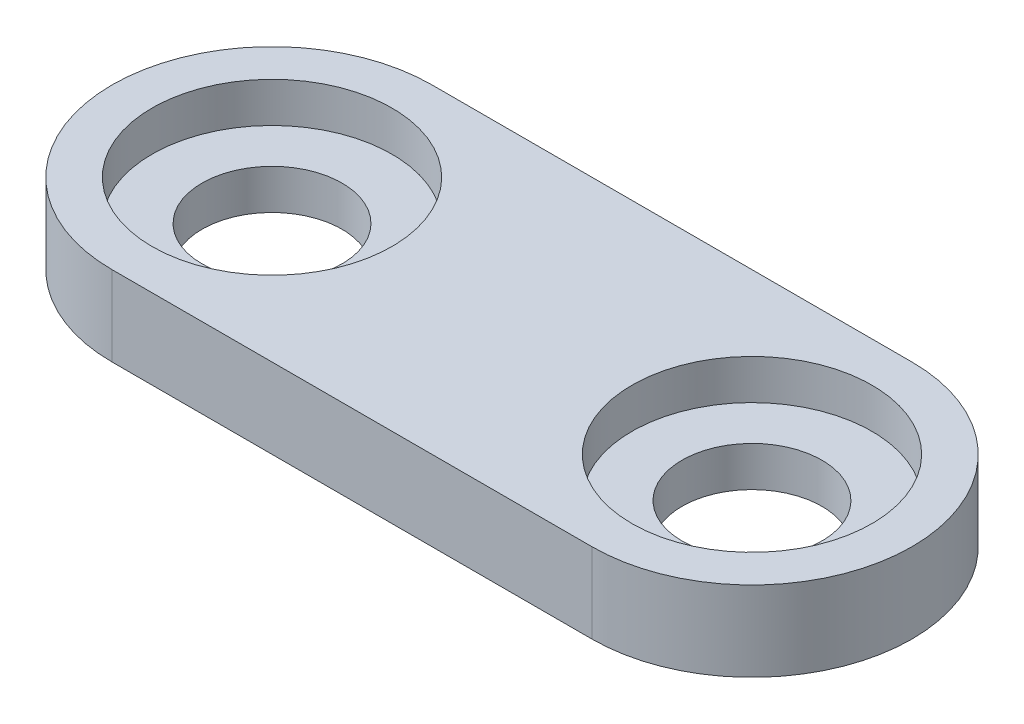
ISO-10303-21;
HEADER;
FILE_DESCRIPTION(('STEP AP214'),'2;1');
FILE_NAME('part.step','',(''),(''),'','','');
FILE_SCHEMA(('AUTOMOTIVE_DESIGN { 1 0 10303 214 1 1 1 1 }'));
ENDSEC;
DATA;
#1=APPLICATION_CONTEXT('core data for automotive mechanical design processes');
#2=APPLICATION_PROTOCOL_DEFINITION('international standard','automotive_design',2000,#1);
#3=PRODUCT_CONTEXT('',#1,'mechanical');
#4=PRODUCT('Part','Part','',(#3));
#5=PRODUCT_RELATED_PRODUCT_CATEGORY('part','',(#4));
#6=PRODUCT_DEFINITION_FORMATION('','',#4);
#7=PRODUCT_DEFINITION_CONTEXT('part definition',#1,'design');
#8=PRODUCT_DEFINITION('design','',#6,#7);
#9=PRODUCT_DEFINITION_SHAPE('','',#8);
#10=(LENGTH_UNIT() NAMED_UNIT(*) SI_UNIT(.MILLI.,.METRE.));
#11=(NAMED_UNIT(*) PLANE_ANGLE_UNIT() SI_UNIT($,.RADIAN.));
#12=(NAMED_UNIT(*) SI_UNIT($,.STERADIAN.) SOLID_ANGLE_UNIT());
#13=UNCERTAINTY_MEASURE_WITH_UNIT(LENGTH_MEASURE(1.E-05),#10,'distance_accuracy_value','');
#14=(GEOMETRIC_REPRESENTATION_CONTEXT(3) GLOBAL_UNCERTAINTY_ASSIGNED_CONTEXT((#13)) GLOBAL_UNIT_ASSIGNED_CONTEXT((#10,
#11,#12)) REPRESENTATION_CONTEXT('',''));
#15=CARTESIAN_POINT('',(0.,0.,0.));
#16=DIRECTION('',(0.,0.,1.));
#17=DIRECTION('',(1.,0.,0.));
#18=AXIS2_PLACEMENT_3D('',#15,#16,#17);
#19=CARTESIAN_POINT('',(-6.,2.,0.));
#20=DIRECTION('',(0.,-1.,0.));
#21=DIRECTION('',(0.,0.,-1.));
#22=AXIS2_PLACEMENT_3D('',#19,#20,#21);
#23=CYLINDRICAL_SURFACE('',#22,1.75);
#24=CARTESIAN_POINT('',(-6.,0.,0.));
#25=DIRECTION('',(0.,1.,0.));
#26=DIRECTION('',(0.,0.,1.));
#27=AXIS2_PLACEMENT_3D('',#24,#25,#26);
#28=CIRCLE('',#27,1.75);
#29=CARTESIAN_POINT('',(-6.,0.,1.75));
#30=VERTEX_POINT('',#29);
#31=EDGE_CURVE('E108',#30,#30,#28,.T.);
#32=ORIENTED_EDGE('',*,*,#31,.F.);
#33=EDGE_LOOP('',(#32));
#34=FACE_BOUND('',#33,.T.);
#35=CARTESIAN_POINT('',(-6.,1.,0.));
#36=DIRECTION('',(0.,1.,0.));
#37=DIRECTION('',(0.,0.,1.));
#38=AXIS2_PLACEMENT_3D('',#35,#36,#37);
#39=CIRCLE('',#38,1.75);
#40=CARTESIAN_POINT('',(-6.,1.,1.75));
#41=VERTEX_POINT('',#40);
#42=EDGE_CURVE('E43',#41,#41,#39,.T.);
#43=ORIENTED_EDGE('',*,*,#42,.T.);
#44=EDGE_LOOP('',(#43));
#45=FACE_BOUND('',#44,.T.);
#46=ADVANCED_FACE('F39',(#34,#45),#23,.F.);
#47=CARTESIAN_POINT('',(6.,2.,0.));
#48=DIRECTION('',(0.,-1.,0.));
#49=DIRECTION('',(0.,0.,-1.));
#50=AXIS2_PLACEMENT_3D('',#47,#48,#49);
#51=CYLINDRICAL_SURFACE('',#50,1.75);
#52=CARTESIAN_POINT('',(6.,0.,0.));
#53=DIRECTION('',(0.,1.,0.));
#54=DIRECTION('',(0.,0.,1.));
#55=AXIS2_PLACEMENT_3D('',#52,#53,#54);
#56=CIRCLE('',#55,1.75);
#57=CARTESIAN_POINT('',(6.,0.,1.75));
#58=VERTEX_POINT('',#57);
#59=EDGE_CURVE('E116',#58,#58,#56,.T.);
#60=ORIENTED_EDGE('',*,*,#59,.F.);
#61=EDGE_LOOP('',(#60));
#62=FACE_BOUND('',#61,.T.);
#63=CARTESIAN_POINT('',(6.,1.,0.));
#64=DIRECTION('',(0.,1.,0.));
#65=DIRECTION('',(0.,0.,1.));
#66=AXIS2_PLACEMENT_3D('',#63,#64,#65);
#67=CIRCLE('',#66,1.75);
#68=CARTESIAN_POINT('',(6.,1.,1.75));
#69=VERTEX_POINT('',#68);
#70=EDGE_CURVE('E111',#69,#69,#67,.T.);
#71=ORIENTED_EDGE('',*,*,#70,.T.);
#72=EDGE_LOOP('',(#71));
#73=FACE_BOUND('',#72,.T.);
#74=ADVANCED_FACE('F144',(#62,#73),#51,.F.);
#75=CARTESIAN_POINT('',(-6.,2.,0.));
#76=DIRECTION('',(0.,-1.,0.));
#77=DIRECTION('',(0.,0.,-1.));
#78=AXIS2_PLACEMENT_3D('',#75,#76,#77);
#79=PLANE('',#78);
#80=CARTESIAN_POINT('',(-6.,2.,0.));
#81=DIRECTION('',(0.,1.,0.));
#82=DIRECTION('',(0.,0.,1.));
#83=AXIS2_PLACEMENT_3D('',#80,#81,#82);
#84=CIRCLE('',#83,3.);
#85=CARTESIAN_POINT('',(-6.,2.,3.));
#86=VERTEX_POINT('',#85);
#87=EDGE_CURVE('E125',#86,#86,#84,.T.);
#88=ORIENTED_EDGE('',*,*,#87,.F.);
#89=EDGE_LOOP('',(#88));
#90=FACE_BOUND('',#89,.T.);
#91=CARTESIAN_POINT('',(6.,2.,0.));
#92=DIRECTION('',(0.,1.,0.));
#93=DIRECTION('',(0.,0.,1.));
#94=AXIS2_PLACEMENT_3D('',#91,#92,#93);
#95=CIRCLE('',#94,3.);
#96=CARTESIAN_POINT('',(6.,2.,3.));
#97=VERTEX_POINT('',#96);
#98=EDGE_CURVE('E130',#97,#97,#95,.T.);
#99=ORIENTED_EDGE('',*,*,#98,.F.);
#100=EDGE_LOOP('',(#99));
#101=FACE_BOUND('',#100,.T.);
#102=CARTESIAN_POINT('',(-6.,2.,0.));
#103=DIRECTION('',(0.,1.,0.));
#104=DIRECTION('',(0.,0.,-1.));
#105=AXIS2_PLACEMENT_3D('',#102,#103,#104);
#106=CIRCLE('',#105,4.);
#107=CARTESIAN_POINT('',(-6.,2.,-4.));
#108=VERTEX_POINT('',#107);
#109=CARTESIAN_POINT('',(-6.,2.,4.));
#110=VERTEX_POINT('',#109);
#111=EDGE_CURVE('E91',#108,#110,#106,.T.);
#112=ORIENTED_EDGE('',*,*,#111,.T.);
#113=DIRECTION('',(1.,0.,0.));
#114=VECTOR('',#113,1.);
#115=CARTESIAN_POINT('',(6.,2.,4.));
#116=LINE('',#115,#114);
#117=CARTESIAN_POINT('',(6.,2.,4.));
#118=VERTEX_POINT('',#117);
#119=EDGE_CURVE('E86',#110,#118,#116,.T.);
#120=ORIENTED_EDGE('',*,*,#119,.T.);
#121=CARTESIAN_POINT('',(6.,2.,0.));
#122=DIRECTION('',(0.,1.,0.));
#123=DIRECTION('',(0.,0.,1.));
#124=AXIS2_PLACEMENT_3D('',#121,#122,#123);
#125=CIRCLE('',#124,4.);
#126=CARTESIAN_POINT('',(6.,2.,-4.));
#127=VERTEX_POINT('',#126);
#128=EDGE_CURVE('E93',#118,#127,#125,.T.);
#129=ORIENTED_EDGE('',*,*,#128,.T.);
#130=DIRECTION('',(-1.,0.,0.));
#131=VECTOR('',#130,1.);
#132=CARTESIAN_POINT('',(-6.,2.,-4.));
#133=LINE('',#132,#131);
#134=EDGE_CURVE('E59',#127,#108,#133,.T.);
#135=ORIENTED_EDGE('',*,*,#134,.T.);
#136=EDGE_LOOP('',(#112,#120,#129,#135));
#137=FACE_BOUND('',#136,.T.);
#138=ADVANCED_FACE('F90',(#90,#101,#137),#79,.F.);
#139=CARTESIAN_POINT('',(-6.,0.,0.));
#140=DIRECTION('',(0.,-1.,0.));
#141=DIRECTION('',(0.,0.,-1.));
#142=AXIS2_PLACEMENT_3D('',#139,#140,#141);
#143=PLANE('',#142);
#144=ORIENTED_EDGE('',*,*,#31,.T.);
#145=EDGE_LOOP('',(#144));
#146=FACE_BOUND('',#145,.T.);
#147=CARTESIAN_POINT('',(-6.,0.,0.));
#148=DIRECTION('',(0.,1.,0.));
#149=DIRECTION('',(0.,0.,-1.));
#150=AXIS2_PLACEMENT_3D('',#147,#148,#149);
#151=CIRCLE('',#150,4.);
#152=CARTESIAN_POINT('',(-6.,0.,-4.));
#153=VERTEX_POINT('',#152);
#154=CARTESIAN_POINT('',(-6.,0.,4.));
#155=VERTEX_POINT('',#154);
#156=EDGE_CURVE('E106',#153,#155,#151,.T.);
#157=ORIENTED_EDGE('',*,*,#156,.F.);
#158=DIRECTION('',(-1.,0.,0.));
#159=VECTOR('',#158,1.);
#160=CARTESIAN_POINT('',(-6.,0.,-4.));
#161=LINE('',#160,#159);
#162=CARTESIAN_POINT('',(6.,0.,-4.));
#163=VERTEX_POINT('',#162);
#164=EDGE_CURVE('E81',#163,#153,#161,.T.);
#165=ORIENTED_EDGE('',*,*,#164,.F.);
#166=CARTESIAN_POINT('',(6.,0.,0.));
#167=DIRECTION('',(0.,1.,0.));
#168=DIRECTION('',(0.,0.,1.));
#169=AXIS2_PLACEMENT_3D('',#166,#167,#168);
#170=CIRCLE('',#169,4.);
#171=CARTESIAN_POINT('',(6.,0.,4.));
#172=VERTEX_POINT('',#171);
#173=EDGE_CURVE('E73',#172,#163,#170,.T.);
#174=ORIENTED_EDGE('',*,*,#173,.F.);
#175=DIRECTION('',(1.,0.,0.));
#176=VECTOR('',#175,1.);
#177=CARTESIAN_POINT('',(6.,0.,4.));
#178=LINE('',#177,#176);
#179=EDGE_CURVE('E100',#155,#172,#178,.T.);
#180=ORIENTED_EDGE('',*,*,#179,.F.);
#181=EDGE_LOOP('',(#157,#165,#174,#180));
#182=FACE_BOUND('',#181,.T.);
#183=ORIENTED_EDGE('',*,*,#59,.T.);
#184=EDGE_LOOP('',(#183));
#185=FACE_BOUND('',#184,.T.);
#186=ADVANCED_FACE('F139',(#146,#182,#185),#143,.T.);
#187=CARTESIAN_POINT('',(-6.,2.,0.));
#188=DIRECTION('',(0.,-1.,0.));
#189=DIRECTION('',(0.,0.,-1.));
#190=AXIS2_PLACEMENT_3D('',#187,#188,#189);
#191=CYLINDRICAL_SURFACE('',#190,4.);
#192=ORIENTED_EDGE('',*,*,#156,.T.);
#193=DIRECTION('',(0.,-1.,0.));
#194=VECTOR('',#193,1.);
#195=CARTESIAN_POINT('',(-6.,2.,4.));
#196=LINE('',#195,#194);
#197=EDGE_CURVE('E11',#110,#155,#196,.T.);
#198=ORIENTED_EDGE('',*,*,#197,.F.);
#199=ORIENTED_EDGE('',*,*,#111,.F.);
#200=DIRECTION('',(0.,-1.,0.));
#201=VECTOR('',#200,1.);
#202=CARTESIAN_POINT('',(-6.,2.,-4.));
#203=LINE('',#202,#201);
#204=EDGE_CURVE('E105',#108,#153,#203,.T.);
#205=ORIENTED_EDGE('',*,*,#204,.T.);
#206=EDGE_LOOP('',(#192,#198,#199,#205));
#207=FACE_BOUND('',#206,.T.);
#208=ADVANCED_FACE('F41',(#207),#191,.T.);
#209=CARTESIAN_POINT('',(6.,2.,4.));
#210=DIRECTION('',(0.,0.,-1.));
#211=DIRECTION('',(-1.,0.,0.));
#212=AXIS2_PLACEMENT_3D('',#209,#210,#211);
#213=PLANE('',#212);
#214=ORIENTED_EDGE('',*,*,#179,.T.);
#215=DIRECTION('',(0.,-1.,0.));
#216=VECTOR('',#215,1.);
#217=CARTESIAN_POINT('',(6.,2.,4.));
#218=LINE('',#217,#216);
#219=EDGE_CURVE('E47',#118,#172,#218,.T.);
#220=ORIENTED_EDGE('',*,*,#219,.F.);
#221=ORIENTED_EDGE('',*,*,#119,.F.);
#222=ORIENTED_EDGE('',*,*,#197,.T.);
#223=EDGE_LOOP('',(#214,#220,#221,#222));
#224=FACE_BOUND('',#223,.T.);
#225=ADVANCED_FACE('F96',(#224),#213,.F.);
#226=CARTESIAN_POINT('',(6.,2.,0.));
#227=DIRECTION('',(0.,-1.,0.));
#228=DIRECTION('',(0.,0.,-1.));
#229=AXIS2_PLACEMENT_3D('',#226,#227,#228);
#230=CYLINDRICAL_SURFACE('',#229,4.);
#231=ORIENTED_EDGE('',*,*,#173,.T.);
#232=DIRECTION('',(0.,-1.,0.));
#233=VECTOR('',#232,1.);
#234=CARTESIAN_POINT('',(6.,2.,-4.));
#235=LINE('',#234,#233);
#236=EDGE_CURVE('E98',#127,#163,#235,.T.);
#237=ORIENTED_EDGE('',*,*,#236,.F.);
#238=ORIENTED_EDGE('',*,*,#128,.F.);
#239=ORIENTED_EDGE('',*,*,#219,.T.);
#240=EDGE_LOOP('',(#231,#237,#238,#239));
#241=FACE_BOUND('',#240,.T.);
#242=ADVANCED_FACE('F99',(#241),#230,.T.);
#243=CARTESIAN_POINT('',(-6.,2.,-4.));
#244=DIRECTION('',(0.,0.,1.));
#245=DIRECTION('',(1.,0.,0.));
#246=AXIS2_PLACEMENT_3D('',#243,#244,#245);
#247=PLANE('',#246);
#248=ORIENTED_EDGE('',*,*,#164,.T.);
#249=ORIENTED_EDGE('',*,*,#204,.F.);
#250=ORIENTED_EDGE('',*,*,#134,.F.);
#251=ORIENTED_EDGE('',*,*,#236,.T.);
#252=EDGE_LOOP('',(#248,#249,#250,#251));
#253=FACE_BOUND('',#252,.T.);
#254=ADVANCED_FACE('F162',(#253),#247,.F.);
#255=CARTESIAN_POINT('',(6.,1.,0.));
#256=DIRECTION('',(0.,1.,0.));
#257=DIRECTION('',(0.,0.,1.));
#258=AXIS2_PLACEMENT_3D('',#255,#256,#257);
#259=CYLINDRICAL_SURFACE('',#258,3.);
#260=CARTESIAN_POINT('',(6.,1.,0.));
#261=DIRECTION('',(0.,1.,0.));
#262=DIRECTION('',(0.,0.,1.));
#263=AXIS2_PLACEMENT_3D('',#260,#261,#262);
#264=CIRCLE('',#263,3.);
#265=CARTESIAN_POINT('',(6.,1.,3.));
#266=VERTEX_POINT('',#265);
#267=EDGE_CURVE('E134',#266,#266,#264,.T.);
#268=ORIENTED_EDGE('',*,*,#267,.F.);
#269=EDGE_LOOP('',(#268));
#270=FACE_BOUND('',#269,.T.);
#271=ORIENTED_EDGE('',*,*,#98,.T.);
#272=EDGE_LOOP('',(#271));
#273=FACE_BOUND('',#272,.T.);
#274=ADVANCED_FACE('F159',(#270,#273),#259,.F.);
#275=CARTESIAN_POINT('',(6.,1.,0.));
#276=DIRECTION('',(0.,1.,0.));
#277=DIRECTION('',(0.,0.,1.));
#278=AXIS2_PLACEMENT_3D('',#275,#276,#277);
#279=PLANE('',#278);
#280=ORIENTED_EDGE('',*,*,#70,.F.);
#281=EDGE_LOOP('',(#280));
#282=FACE_BOUND('',#281,.T.);
#283=ORIENTED_EDGE('',*,*,#267,.T.);
#284=EDGE_LOOP('',(#283));
#285=FACE_BOUND('',#284,.T.);
#286=ADVANCED_FACE('F156',(#282,#285),#279,.T.);
#287=CARTESIAN_POINT('',(-6.,1.,0.));
#288=DIRECTION('',(0.,1.,0.));
#289=DIRECTION('',(0.,0.,1.));
#290=AXIS2_PLACEMENT_3D('',#287,#288,#289);
#291=CYLINDRICAL_SURFACE('',#290,3.);
#292=CARTESIAN_POINT('',(-6.,1.,0.));
#293=DIRECTION('',(0.,1.,0.));
#294=DIRECTION('',(0.,0.,1.));
#295=AXIS2_PLACEMENT_3D('',#292,#293,#294);
#296=CIRCLE('',#295,3.);
#297=CARTESIAN_POINT('',(-6.,1.,3.));
#298=VERTEX_POINT('',#297);
#299=EDGE_CURVE('E118',#298,#298,#296,.T.);
#300=ORIENTED_EDGE('',*,*,#299,.F.);
#301=EDGE_LOOP('',(#300));
#302=FACE_BOUND('',#301,.T.);
#303=ORIENTED_EDGE('',*,*,#87,.T.);
#304=EDGE_LOOP('',(#303));
#305=FACE_BOUND('',#304,.T.);
#306=ADVANCED_FACE('F151',(#302,#305),#291,.F.);
#307=CARTESIAN_POINT('',(-6.,1.,0.));
#308=DIRECTION('',(0.,1.,0.));
#309=DIRECTION('',(0.,0.,1.));
#310=AXIS2_PLACEMENT_3D('',#307,#308,#309);
#311=PLANE('',#310);
#312=ORIENTED_EDGE('',*,*,#42,.F.);
#313=EDGE_LOOP('',(#312));
#314=FACE_BOUND('',#313,.T.);
#315=ORIENTED_EDGE('',*,*,#299,.T.);
#316=EDGE_LOOP('',(#315));
#317=FACE_BOUND('',#316,.T.);
#318=ADVANCED_FACE('F149',(#314,#317),#311,.T.);
#319=CLOSED_SHELL('',(#46,#74,#138,#186,#208,#225,#242,#254,#274,#286,#306,#318));
#320=MANIFOLD_SOLID_BREP('B2',#319);
#321=ADVANCED_BREP_SHAPE_REPRESENTATION('',(#18,#320),#14);
#322=SHAPE_DEFINITION_REPRESENTATION(#9,#321);
ENDSEC;
END-ISO-10303-21;
